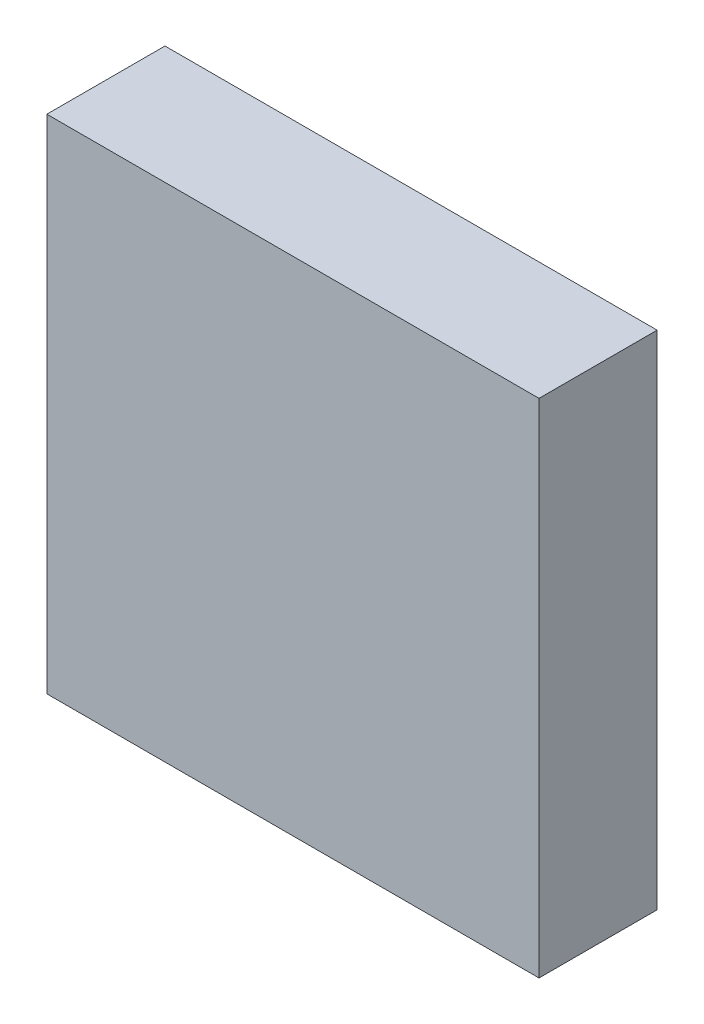
ISO-10303-21;
HEADER;
FILE_DESCRIPTION(('STEP AP214'),'2;1');
FILE_NAME('part.step','',(''),(''),'','','');
FILE_SCHEMA(('AUTOMOTIVE_DESIGN { 1 0 10303 214 1 1 1 1 }'));
ENDSEC;
DATA;
#1=APPLICATION_CONTEXT('core data for automotive mechanical design processes');
#2=APPLICATION_PROTOCOL_DEFINITION('international standard','automotive_design',2000,#1);
#3=PRODUCT_CONTEXT('',#1,'mechanical');
#4=PRODUCT('Part','Part','',(#3));
#5=PRODUCT_RELATED_PRODUCT_CATEGORY('part','',(#4));
#6=PRODUCT_DEFINITION_FORMATION('','',#4);
#7=PRODUCT_DEFINITION_CONTEXT('part definition',#1,'design');
#8=PRODUCT_DEFINITION('design','',#6,#7);
#9=PRODUCT_DEFINITION_SHAPE('','',#8);
#10=(LENGTH_UNIT() NAMED_UNIT(*) SI_UNIT(.MILLI.,.METRE.));
#11=(NAMED_UNIT(*) PLANE_ANGLE_UNIT() SI_UNIT($,.RADIAN.));
#12=(NAMED_UNIT(*) SI_UNIT($,.STERADIAN.) SOLID_ANGLE_UNIT());
#13=UNCERTAINTY_MEASURE_WITH_UNIT(LENGTH_MEASURE(1.E-05),#10,'distance_accuracy_value','');
#14=(GEOMETRIC_REPRESENTATION_CONTEXT(3) GLOBAL_UNCERTAINTY_ASSIGNED_CONTEXT((#13)) GLOBAL_UNIT_ASSIGNED_CONTEXT((#10,
#11,#12)) REPRESENTATION_CONTEXT('',''));
#15=CARTESIAN_POINT('',(0.,0.,0.));
#16=DIRECTION('',(0.,0.,1.));
#17=DIRECTION('',(1.,0.,0.));
#18=AXIS2_PLACEMENT_3D('',#15,#16,#17);
#19=CARTESIAN_POINT('',(0.,0.,12.));
#20=DIRECTION('',(1.,0.,0.));
#21=DIRECTION('',(0.,1.,0.));
#22=AXIS2_PLACEMENT_3D('',#19,#20,#21);
#23=PLANE('',#22);
#24=DIRECTION('',(0.,-1.,0.));
#25=VECTOR('',#24,1.);
#26=CARTESIAN_POINT('',(0.,0.,0.));
#27=LINE('',#26,#25);
#28=CARTESIAN_POINT('',(0.,0.,0.));
#29=VERTEX_POINT('',#28);
#30=CARTESIAN_POINT('',(0.,-51.,0.));
#31=VERTEX_POINT('',#30);
#32=EDGE_CURVE('E100',#29,#31,#27,.T.);
#33=ORIENTED_EDGE('',*,*,#32,.T.);
#34=DIRECTION('',(0.,0.,-1.));
#35=VECTOR('',#34,1.);
#36=CARTESIAN_POINT('',(0.,-51.,12.));
#37=LINE('',#36,#35);
#38=CARTESIAN_POINT('',(0.,-51.,12.));
#39=VERTEX_POINT('',#38);
#40=EDGE_CURVE('E11',#39,#31,#37,.T.);
#41=ORIENTED_EDGE('',*,*,#40,.F.);
#42=DIRECTION('',(0.,-1.,0.));
#43=VECTOR('',#42,1.);
#44=CARTESIAN_POINT('',(0.,0.,12.));
#45=LINE('',#44,#43);
#46=CARTESIAN_POINT('',(0.,0.,12.));
#47=VERTEX_POINT('',#46);
#48=EDGE_CURVE('E88',#47,#39,#45,.T.);
#49=ORIENTED_EDGE('',*,*,#48,.F.);
#50=DIRECTION('',(0.,0.,-1.));
#51=VECTOR('',#50,1.);
#52=CARTESIAN_POINT('',(0.,0.,12.));
#53=LINE('',#52,#51);
#54=EDGE_CURVE('E96',#47,#29,#53,.T.);
#55=ORIENTED_EDGE('',*,*,#54,.T.);
#56=EDGE_LOOP('',(#33,#41,#49,#55));
#57=FACE_BOUND('',#56,.T.);
#58=ADVANCED_FACE('F37',(#57),#23,.F.);
#59=CARTESIAN_POINT('',(0.,-51.,12.));
#60=DIRECTION('',(0.,1.,0.));
#61=DIRECTION('',(0.,0.,1.));
#62=AXIS2_PLACEMENT_3D('',#59,#60,#61);
#63=PLANE('',#62);
#64=DIRECTION('',(1.,0.,0.));
#65=VECTOR('',#64,1.);
#66=CARTESIAN_POINT('',(0.,-51.,0.));
#67=LINE('',#66,#65);
#68=CARTESIAN_POINT('',(50.,-51.,0.));
#69=VERTEX_POINT('',#68);
#70=EDGE_CURVE('E92',#31,#69,#67,.T.);
#71=ORIENTED_EDGE('',*,*,#70,.T.);
#72=DIRECTION('',(0.,0.,-1.));
#73=VECTOR('',#72,1.);
#74=CARTESIAN_POINT('',(50.,-51.,12.));
#75=LINE('',#74,#73);
#76=CARTESIAN_POINT('',(50.,-51.,12.));
#77=VERTEX_POINT('',#76);
#78=EDGE_CURVE('E45',#77,#69,#75,.T.);
#79=ORIENTED_EDGE('',*,*,#78,.F.);
#80=DIRECTION('',(1.,0.,0.));
#81=VECTOR('',#80,1.);
#82=CARTESIAN_POINT('',(0.,-51.,12.));
#83=LINE('',#82,#81);
#84=EDGE_CURVE('E83',#39,#77,#83,.T.);
#85=ORIENTED_EDGE('',*,*,#84,.F.);
#86=ORIENTED_EDGE('',*,*,#40,.T.);
#87=EDGE_LOOP('',(#71,#79,#85,#86));
#88=FACE_BOUND('',#87,.T.);
#89=ADVANCED_FACE('F91',(#88),#63,.F.);
#90=CARTESIAN_POINT('',(50.,0.,12.));
#91=DIRECTION('',(-1.,0.,0.));
#92=DIRECTION('',(0.,0.,1.));
#93=AXIS2_PLACEMENT_3D('',#90,#91,#92);
#94=PLANE('',#93);
#95=DIRECTION('',(0.,1.,0.));
#96=VECTOR('',#95,1.);
#97=CARTESIAN_POINT('',(50.,0.,0.));
#98=LINE('',#97,#96);
#99=CARTESIAN_POINT('',(50.,0.,0.));
#100=VERTEX_POINT('',#99);
#101=EDGE_CURVE('E70',#69,#100,#98,.T.);
#102=ORIENTED_EDGE('',*,*,#101,.T.);
#103=DIRECTION('',(0.,0.,-1.));
#104=VECTOR('',#103,1.);
#105=CARTESIAN_POINT('',(50.,0.,12.));
#106=LINE('',#105,#104);
#107=CARTESIAN_POINT('',(50.,0.,12.));
#108=VERTEX_POINT('',#107);
#109=EDGE_CURVE('E93',#108,#100,#106,.T.);
#110=ORIENTED_EDGE('',*,*,#109,.F.);
#111=DIRECTION('',(0.,1.,0.));
#112=VECTOR('',#111,1.);
#113=CARTESIAN_POINT('',(50.,0.,12.));
#114=LINE('',#113,#112);
#115=EDGE_CURVE('E86',#77,#108,#114,.T.);
#116=ORIENTED_EDGE('',*,*,#115,.F.);
#117=ORIENTED_EDGE('',*,*,#78,.T.);
#118=EDGE_LOOP('',(#102,#110,#116,#117));
#119=FACE_BOUND('',#118,.T.);
#120=ADVANCED_FACE('F94',(#119),#94,.F.);
#121=CARTESIAN_POINT('',(0.,0.,12.));
#122=DIRECTION('',(0.,-1.,0.));
#123=DIRECTION('',(0.,0.,-1.));
#124=AXIS2_PLACEMENT_3D('',#121,#122,#123);
#125=PLANE('',#124);
#126=DIRECTION('',(-1.,0.,0.));
#127=VECTOR('',#126,1.);
#128=CARTESIAN_POINT('',(0.,0.,0.));
#129=LINE('',#128,#127);
#130=EDGE_CURVE('E76',#100,#29,#129,.T.);
#131=ORIENTED_EDGE('',*,*,#130,.T.);
#132=ORIENTED_EDGE('',*,*,#54,.F.);
#133=DIRECTION('',(-1.,0.,0.));
#134=VECTOR('',#133,1.);
#135=CARTESIAN_POINT('',(0.,0.,12.));
#136=LINE('',#135,#134);
#137=EDGE_CURVE('E53',#108,#47,#136,.T.);
#138=ORIENTED_EDGE('',*,*,#137,.F.);
#139=ORIENTED_EDGE('',*,*,#109,.T.);
#140=EDGE_LOOP('',(#131,#132,#138,#139));
#141=FACE_BOUND('',#140,.T.);
#142=ADVANCED_FACE('F107',(#141),#125,.F.);
#143=CARTESIAN_POINT('',(0.,0.,12.));
#144=DIRECTION('',(0.,0.,1.));
#145=DIRECTION('',(1.,0.,0.));
#146=AXIS2_PLACEMENT_3D('',#143,#144,#145);
#147=PLANE('',#146);
#148=ORIENTED_EDGE('',*,*,#48,.T.);
#149=ORIENTED_EDGE('',*,*,#84,.T.);
#150=ORIENTED_EDGE('',*,*,#115,.T.);
#151=ORIENTED_EDGE('',*,*,#137,.T.);
#152=EDGE_LOOP('',(#148,#149,#150,#151));
#153=FACE_BOUND('',#152,.T.);
#154=ADVANCED_FACE('F84',(#153),#147,.T.);
#155=CARTESIAN_POINT('',(0.,0.,0.));
#156=DIRECTION('',(0.,0.,1.));
#157=DIRECTION('',(1.,0.,0.));
#158=AXIS2_PLACEMENT_3D('',#155,#156,#157);
#159=PLANE('',#158);
#160=ORIENTED_EDGE('',*,*,#32,.F.);
#161=ORIENTED_EDGE('',*,*,#130,.F.);
#162=ORIENTED_EDGE('',*,*,#101,.F.);
#163=ORIENTED_EDGE('',*,*,#70,.F.);
#164=EDGE_LOOP('',(#160,#161,#162,#163));
#165=FACE_BOUND('',#164,.T.);
#166=ADVANCED_FACE('F110',(#165),#159,.F.);
#167=CLOSED_SHELL('',(#58,#89,#120,#142,#154,#166));
#168=MANIFOLD_SOLID_BREP('B2',#167);
#169=ADVANCED_BREP_SHAPE_REPRESENTATION('',(#18,#168),#14);
#170=SHAPE_DEFINITION_REPRESENTATION(#9,#169);
ENDSEC;
END-ISO-10303-21;
